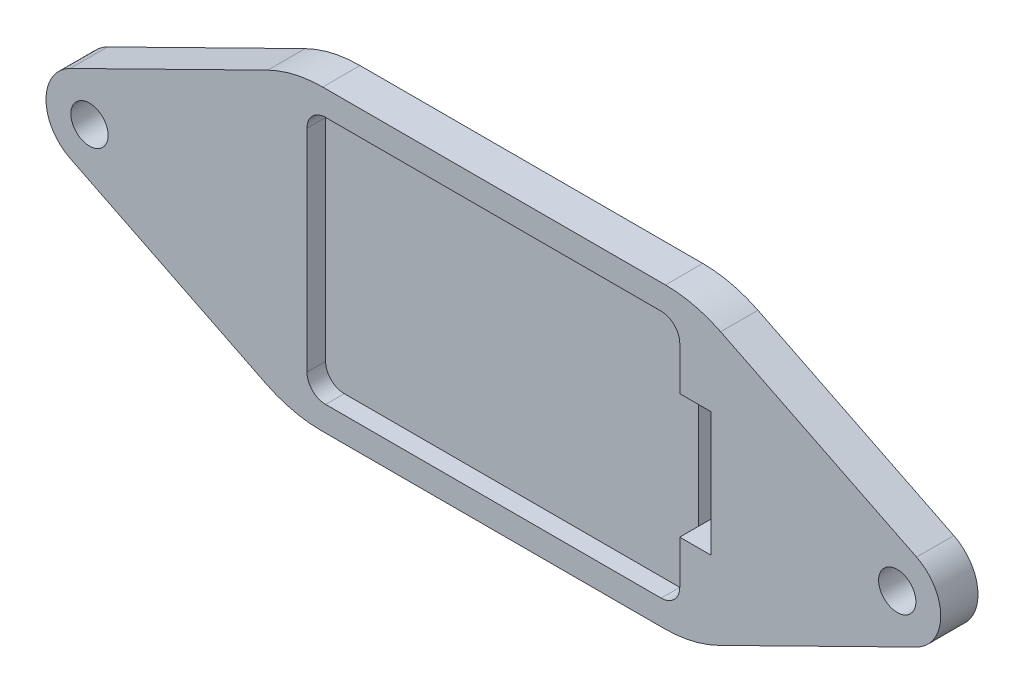
ISO-10303-21;
HEADER;
FILE_DESCRIPTION(('STEP AP214'),'2;1');
FILE_NAME('part.step','',(''),(''),'','','');
FILE_SCHEMA(('AUTOMOTIVE_DESIGN { 1 0 10303 214 1 1 1 1 }'));
ENDSEC;
DATA;
#1=APPLICATION_CONTEXT('core data for automotive mechanical design processes');
#2=APPLICATION_PROTOCOL_DEFINITION('international standard','automotive_design',2000,#1);
#3=PRODUCT_CONTEXT('',#1,'mechanical');
#4=PRODUCT('Part','Part','',(#3));
#5=PRODUCT_RELATED_PRODUCT_CATEGORY('part','',(#4));
#6=PRODUCT_DEFINITION_FORMATION('','',#4);
#7=PRODUCT_DEFINITION_CONTEXT('part definition',#1,'design');
#8=PRODUCT_DEFINITION('design','',#6,#7);
#9=PRODUCT_DEFINITION_SHAPE('','',#8);
#10=(LENGTH_UNIT() NAMED_UNIT(*) SI_UNIT(.MILLI.,.METRE.));
#11=(NAMED_UNIT(*) PLANE_ANGLE_UNIT() SI_UNIT($,.RADIAN.));
#12=(NAMED_UNIT(*) SI_UNIT($,.STERADIAN.) SOLID_ANGLE_UNIT());
#13=UNCERTAINTY_MEASURE_WITH_UNIT(LENGTH_MEASURE(1.E-05),#10,'distance_accuracy_value','');
#14=(GEOMETRIC_REPRESENTATION_CONTEXT(3) GLOBAL_UNCERTAINTY_ASSIGNED_CONTEXT((#13)) GLOBAL_UNIT_ASSIGNED_CONTEXT((#10,
#11,#12)) REPRESENTATION_CONTEXT('',''));
#15=CARTESIAN_POINT('',(0.,0.,0.));
#16=DIRECTION('',(0.,0.,1.));
#17=DIRECTION('',(1.,0.,0.));
#18=AXIS2_PLACEMENT_3D('',#15,#16,#17);
#19=CARTESIAN_POINT('',(0.,12.,3.));
#20=DIRECTION('',(0.,1.,0.));
#21=DIRECTION('',(-1.,0.,0.));
#22=AXIS2_PLACEMENT_3D('',#19,#20,#21);
#23=PLANE('',#22);
#24=DIRECTION('',(1.,0.,0.));
#25=VECTOR('',#24,1.);
#26=CARTESIAN_POINT('',(0.,12.,0.));
#27=LINE('',#26,#25);
#28=CARTESIAN_POINT('',(-13.7318893017713,12.,0.));
#29=VERTEX_POINT('',#28);
#30=CARTESIAN_POINT('',(13.8470717310372,12.,0.));
#31=VERTEX_POINT('',#30);
#32=EDGE_CURVE('E220',#29,#31,#27,.T.);
#33=ORIENTED_EDGE('',*,*,#32,.F.);
#34=DIRECTION('',(0.,0.,-1.));
#35=VECTOR('',#34,1.);
#36=CARTESIAN_POINT('',(-13.7318893017713,12.,3.));
#37=LINE('',#36,#35);
#38=CARTESIAN_POINT('',(-13.7318893017713,12.,3.));
#39=VERTEX_POINT('',#38);
#40=EDGE_CURVE('E11',#39,#29,#37,.T.);
#41=ORIENTED_EDGE('',*,*,#40,.F.);
#42=DIRECTION('',(1.,0.,0.));
#43=VECTOR('',#42,1.);
#44=CARTESIAN_POINT('',(0.,12.,3.));
#45=LINE('',#44,#43);
#46=CARTESIAN_POINT('',(13.8470717310372,12.,3.));
#47=VERTEX_POINT('',#46);
#48=EDGE_CURVE('E399',#39,#47,#45,.T.);
#49=ORIENTED_EDGE('',*,*,#48,.T.);
#50=DIRECTION('',(0.,0.,-1.));
#51=VECTOR('',#50,1.);
#52=CARTESIAN_POINT('',(13.8470717310372,12.,3.));
#53=LINE('',#52,#51);
#54=EDGE_CURVE('E105',#47,#31,#53,.T.);
#55=ORIENTED_EDGE('',*,*,#54,.T.);
#56=EDGE_LOOP('',(#33,#41,#49,#55));
#57=FACE_BOUND('',#56,.T.);
#58=ADVANCED_FACE('F33',(#57),#23,.T.);
#59=CARTESIAN_POINT('',(-13.7318893017713,2.,3.));
#60=DIRECTION('',(0.,0.,-1.));
#61=DIRECTION('',(-1.,0.,0.));
#62=AXIS2_PLACEMENT_3D('',#59,#60,#61);
#63=CYLINDRICAL_SURFACE('',#62,10.);
#64=CARTESIAN_POINT('',(-13.7318893017713,2.,0.));
#65=DIRECTION('',(0.,0.,1.));
#66=DIRECTION('',(1.,0.,0.));
#67=AXIS2_PLACEMENT_3D('',#64,#65,#66);
#68=CIRCLE('',#67,10.);
#69=CARTESIAN_POINT('',(-18.151142685381,10.9705183535543,0.));
#70=VERTEX_POINT('',#69);
#71=EDGE_CURVE('E223',#29,#70,#68,.T.);
#72=ORIENTED_EDGE('',*,*,#71,.T.);
#73=DIRECTION('',(0.,0.,-1.));
#74=VECTOR('',#73,1.);
#75=CARTESIAN_POINT('',(-18.151142685381,10.9705183535543,3.));
#76=LINE('',#75,#74);
#77=CARTESIAN_POINT('',(-18.151142685381,10.9705183535543,3.));
#78=VERTEX_POINT('',#77);
#79=EDGE_CURVE('E43',#78,#70,#76,.T.);
#80=ORIENTED_EDGE('',*,*,#79,.F.);
#81=CARTESIAN_POINT('',(-13.7318893017713,2.,3.));
#82=DIRECTION('',(0.,0.,1.));
#83=DIRECTION('',(1.,0.,0.));
#84=AXIS2_PLACEMENT_3D('',#81,#82,#83);
#85=CIRCLE('',#84,10.);
#86=EDGE_CURVE('E401',#39,#78,#85,.T.);
#87=ORIENTED_EDGE('',*,*,#86,.F.);
#88=ORIENTED_EDGE('',*,*,#40,.T.);
#89=EDGE_LOOP('',(#72,#80,#87,#88));
#90=FACE_BOUND('',#89,.T.);
#91=ADVANCED_FACE('F442',(#90),#63,.T.);
#92=CARTESIAN_POINT('',(-7.89392383654079,16.0236543394143,3.));
#93=DIRECTION('',(-0.44192533836097,0.897051835355428,0.));
#94=DIRECTION('',(-0.897051835355428,-0.441925338360971,0.));
#95=AXIS2_PLACEMENT_3D('',#92,#93,#94);
#96=PLANE('',#95);
#97=DIRECTION('',(0.897051835355428,0.441925338360971,0.));
#98=VECTOR('',#97,1.);
#99=CARTESIAN_POINT('',(-7.89392383654079,16.0236543394143,0.));
#100=LINE('',#99,#98);
#101=CARTESIAN_POINT('',(-34.0467386842634,3.139681423744,0.));
#102=VERTEX_POINT('',#101);
#103=EDGE_CURVE('E226',#102,#70,#100,.T.);
#104=ORIENTED_EDGE('',*,*,#103,.F.);
#105=DIRECTION('',(0.,0.,-1.));
#106=VECTOR('',#105,1.);
#107=CARTESIAN_POINT('',(-34.0467386842634,3.139681423744,3.));
#108=LINE('',#107,#106);
#109=CARTESIAN_POINT('',(-34.0467386842634,3.139681423744,3.));
#110=VERTEX_POINT('',#109);
#111=EDGE_CURVE('E267',#110,#102,#108,.T.);
#112=ORIENTED_EDGE('',*,*,#111,.F.);
#113=DIRECTION('',(0.897051835355428,0.441925338360971,0.));
#114=VECTOR('',#113,1.);
#115=CARTESIAN_POINT('',(-7.89392383654079,16.0236543394143,3.));
#116=LINE('',#115,#114);
#117=EDGE_CURVE('E403',#110,#78,#116,.T.);
#118=ORIENTED_EDGE('',*,*,#117,.T.);
#119=ORIENTED_EDGE('',*,*,#79,.T.);
#120=EDGE_LOOP('',(#104,#112,#118,#119));
#121=FACE_BOUND('',#120,.T.);
#122=ADVANCED_FACE('F447',(#121),#96,.T.);
#123=CARTESIAN_POINT('',(-32.5,0.,3.));
#124=DIRECTION('',(0.,0.,-1.));
#125=DIRECTION('',(-1.,0.,0.));
#126=AXIS2_PLACEMENT_3D('',#123,#124,#125);
#127=CYLINDRICAL_SURFACE('',#126,3.5);
#128=CARTESIAN_POINT('',(-32.5,0.,0.));
#129=DIRECTION('',(0.,0.,1.));
#130=DIRECTION('',(1.,0.,0.));
#131=AXIS2_PLACEMENT_3D('',#128,#129,#130);
#132=CIRCLE('',#131,3.5);
#133=CARTESIAN_POINT('',(-34.0558089860166,-3.13519670818755,0.));
#134=VERTEX_POINT('',#133);
#135=EDGE_CURVE('E229',#102,#134,#132,.T.);
#136=ORIENTED_EDGE('',*,*,#135,.T.);
#137=DIRECTION('',(0.,0.,-1.));
#138=VECTOR('',#137,1.);
#139=CARTESIAN_POINT('',(-34.0558089860166,-3.13519670818755,3.));
#140=LINE('',#139,#138);
#141=CARTESIAN_POINT('',(-34.0558089860166,-3.13519670818755,3.));
#142=VERTEX_POINT('',#141);
#143=EDGE_CURVE('E264',#142,#134,#140,.T.);
#144=ORIENTED_EDGE('',*,*,#143,.F.);
#145=CARTESIAN_POINT('',(-32.5,0.,3.));
#146=DIRECTION('',(0.,0.,1.));
#147=DIRECTION('',(1.,0.,0.));
#148=AXIS2_PLACEMENT_3D('',#145,#146,#147);
#149=CIRCLE('',#148,3.5);
#150=EDGE_CURVE('E406',#110,#142,#149,.T.);
#151=ORIENTED_EDGE('',*,*,#150,.F.);
#152=ORIENTED_EDGE('',*,*,#111,.T.);
#153=EDGE_LOOP('',(#136,#144,#151,#152));
#154=FACE_BOUND('',#153,.T.);
#155=ADVANCED_FACE('F565',(#154),#127,.T.);
#156=CARTESIAN_POINT('',(-7.97765404981442,-16.0762117591797,3.));
#157=DIRECTION('',(0.444516853147595,0.895770488053586,0.));
#158=DIRECTION('',(-0.895770488053586,0.444516853147596,0.));
#159=AXIS2_PLACEMENT_3D('',#156,#157,#158);
#160=PLANE('',#159);
#161=DIRECTION('',(0.895770488053586,-0.444516853147596,0.));
#162=VECTOR('',#161,1.);
#163=CARTESIAN_POINT('',(-7.97765404981442,-16.0762117591797,0.));
#164=LINE('',#163,#162);
#165=CARTESIAN_POINT('',(-18.2922402625132,-10.9577048805359,0.));
#166=VERTEX_POINT('',#165);
#167=EDGE_CURVE('E232',#134,#166,#164,.T.);
#168=ORIENTED_EDGE('',*,*,#167,.T.);
#169=DIRECTION('',(0.,0.,-1.));
#170=VECTOR('',#169,1.);
#171=CARTESIAN_POINT('',(-18.2922402625132,-10.9577048805359,3.));
#172=LINE('',#171,#170);
#173=CARTESIAN_POINT('',(-18.2922402625132,-10.9577048805359,3.));
#174=VERTEX_POINT('',#173);
#175=EDGE_CURVE('E262',#174,#166,#172,.T.);
#176=ORIENTED_EDGE('',*,*,#175,.F.);
#177=DIRECTION('',(0.895770488053586,-0.444516853147596,0.));
#178=VECTOR('',#177,1.);
#179=CARTESIAN_POINT('',(-7.97765404981442,-16.0762117591797,3.));
#180=LINE('',#179,#178);
#181=EDGE_CURVE('E409',#142,#174,#180,.T.);
#182=ORIENTED_EDGE('',*,*,#181,.F.);
#183=ORIENTED_EDGE('',*,*,#143,.T.);
#184=EDGE_LOOP('',(#168,#176,#182,#183));
#185=FACE_BOUND('',#184,.T.);
#186=ADVANCED_FACE('F567',(#185),#160,.F.);
#187=CARTESIAN_POINT('',(-13.8470717310372,-2.,3.));
#188=DIRECTION('',(0.,0.,-1.));
#189=DIRECTION('',(-1.,0.,0.));
#190=AXIS2_PLACEMENT_3D('',#187,#188,#189);
#191=CYLINDRICAL_SURFACE('',#190,10.);
#192=CARTESIAN_POINT('',(-13.8470717310372,-2.,0.));
#193=DIRECTION('',(0.,0.,1.));
#194=DIRECTION('',(1.,0.,0.));
#195=AXIS2_PLACEMENT_3D('',#192,#193,#194);
#196=CIRCLE('',#195,10.);
#197=CARTESIAN_POINT('',(-13.8470717310372,-12.,0.));
#198=VERTEX_POINT('',#197);
#199=EDGE_CURVE('E235',#198,#166,#196,.F.);
#200=ORIENTED_EDGE('',*,*,#199,.F.);
#201=DIRECTION('',(0.,0.,-1.));
#202=VECTOR('',#201,1.);
#203=CARTESIAN_POINT('',(-13.8470717310372,-12.,3.));
#204=LINE('',#203,#202);
#205=CARTESIAN_POINT('',(-13.8470717310372,-12.,3.));
#206=VERTEX_POINT('',#205);
#207=EDGE_CURVE('E260',#206,#198,#204,.T.);
#208=ORIENTED_EDGE('',*,*,#207,.F.);
#209=CARTESIAN_POINT('',(-13.8470717310372,-2.,3.));
#210=DIRECTION('',(0.,0.,1.));
#211=DIRECTION('',(1.,0.,0.));
#212=AXIS2_PLACEMENT_3D('',#209,#210,#211);
#213=CIRCLE('',#212,10.);
#214=EDGE_CURVE('E411',#206,#174,#213,.F.);
#215=ORIENTED_EDGE('',*,*,#214,.T.);
#216=ORIENTED_EDGE('',*,*,#175,.T.);
#217=EDGE_LOOP('',(#200,#208,#215,#216));
#218=FACE_BOUND('',#217,.T.);
#219=ADVANCED_FACE('F570',(#218),#191,.T.);
#220=CARTESIAN_POINT('',(0.,-12.,3.));
#221=DIRECTION('',(0.,1.,0.));
#222=DIRECTION('',(-1.,0.,0.));
#223=AXIS2_PLACEMENT_3D('',#220,#221,#222);
#224=PLANE('',#223);
#225=DIRECTION('',(1.,0.,0.));
#226=VECTOR('',#225,1.);
#227=CARTESIAN_POINT('',(0.,-12.,0.));
#228=LINE('',#227,#226);
#229=CARTESIAN_POINT('',(13.7318893017713,-12.,0.));
#230=VERTEX_POINT('',#229);
#231=EDGE_CURVE('E238',#198,#230,#228,.T.);
#232=ORIENTED_EDGE('',*,*,#231,.T.);
#233=DIRECTION('',(0.,0.,-1.));
#234=VECTOR('',#233,1.);
#235=CARTESIAN_POINT('',(13.7318893017713,-12.,3.));
#236=LINE('',#235,#234);
#237=CARTESIAN_POINT('',(13.7318893017713,-12.,3.));
#238=VERTEX_POINT('',#237);
#239=EDGE_CURVE('E258',#238,#230,#236,.T.);
#240=ORIENTED_EDGE('',*,*,#239,.F.);
#241=DIRECTION('',(1.,0.,0.));
#242=VECTOR('',#241,1.);
#243=CARTESIAN_POINT('',(0.,-12.,3.));
#244=LINE('',#243,#242);
#245=EDGE_CURVE('E414',#206,#238,#244,.T.);
#246=ORIENTED_EDGE('',*,*,#245,.F.);
#247=ORIENTED_EDGE('',*,*,#207,.T.);
#248=EDGE_LOOP('',(#232,#240,#246,#247));
#249=FACE_BOUND('',#248,.T.);
#250=ADVANCED_FACE('F425',(#249),#224,.F.);
#251=CARTESIAN_POINT('',(13.7318893017713,-2.,3.));
#252=DIRECTION('',(0.,0.,-1.));
#253=DIRECTION('',(-1.,0.,0.));
#254=AXIS2_PLACEMENT_3D('',#251,#252,#253);
#255=CYLINDRICAL_SURFACE('',#254,10.);
#256=CARTESIAN_POINT('',(13.7318893017713,-2.,0.));
#257=DIRECTION('',(0.,0.,1.));
#258=DIRECTION('',(1.,0.,0.));
#259=AXIS2_PLACEMENT_3D('',#256,#257,#258);
#260=CIRCLE('',#259,10.);
#261=CARTESIAN_POINT('',(18.151142685381,-10.9705183535543,0.));
#262=VERTEX_POINT('',#261);
#263=EDGE_CURVE('E241',#262,#230,#260,.F.);
#264=ORIENTED_EDGE('',*,*,#263,.F.);
#265=DIRECTION('',(0.,0.,-1.));
#266=VECTOR('',#265,1.);
#267=CARTESIAN_POINT('',(18.151142685381,-10.9705183535543,3.));
#268=LINE('',#267,#266);
#269=CARTESIAN_POINT('',(18.151142685381,-10.9705183535543,3.));
#270=VERTEX_POINT('',#269);
#271=EDGE_CURVE('E256',#270,#262,#268,.T.);
#272=ORIENTED_EDGE('',*,*,#271,.F.);
#273=CARTESIAN_POINT('',(13.7318893017713,-2.,3.));
#274=DIRECTION('',(0.,0.,1.));
#275=DIRECTION('',(1.,0.,0.));
#276=AXIS2_PLACEMENT_3D('',#273,#274,#275);
#277=CIRCLE('',#276,10.);
#278=EDGE_CURVE('E416',#270,#238,#277,.F.);
#279=ORIENTED_EDGE('',*,*,#278,.T.);
#280=ORIENTED_EDGE('',*,*,#239,.T.);
#281=EDGE_LOOP('',(#264,#272,#279,#280));
#282=FACE_BOUND('',#281,.T.);
#283=ADVANCED_FACE('F420',(#282),#255,.T.);
#284=CARTESIAN_POINT('',(7.89392383654079,-16.0236543394143,3.));
#285=DIRECTION('',(-0.44192533836097,0.897051835355428,0.));
#286=DIRECTION('',(-0.897051835355428,-0.44192533836097,0.));
#287=AXIS2_PLACEMENT_3D('',#284,#285,#286);
#288=PLANE('',#287);
#289=DIRECTION('',(0.897051835355428,0.44192533836097,0.));
#290=VECTOR('',#289,1.);
#291=CARTESIAN_POINT('',(7.89392383654079,-16.0236543394143,0.));
#292=LINE('',#291,#290);
#293=CARTESIAN_POINT('',(34.0467386842634,-3.13968142374399,0.));
#294=VERTEX_POINT('',#293);
#295=EDGE_CURVE('E244',#262,#294,#292,.T.);
#296=ORIENTED_EDGE('',*,*,#295,.T.);
#297=DIRECTION('',(0.,0.,-1.));
#298=VECTOR('',#297,1.);
#299=CARTESIAN_POINT('',(34.0467386842634,-3.13968142374399,3.));
#300=LINE('',#299,#298);
#301=CARTESIAN_POINT('',(34.0467386842634,-3.13968142374399,3.));
#302=VERTEX_POINT('',#301);
#303=EDGE_CURVE('E196',#302,#294,#300,.T.);
#304=ORIENTED_EDGE('',*,*,#303,.F.);
#305=DIRECTION('',(0.897051835355428,0.44192533836097,0.));
#306=VECTOR('',#305,1.);
#307=CARTESIAN_POINT('',(7.89392383654079,-16.0236543394143,3.));
#308=LINE('',#307,#306);
#309=EDGE_CURVE('E184',#270,#302,#308,.T.);
#310=ORIENTED_EDGE('',*,*,#309,.F.);
#311=ORIENTED_EDGE('',*,*,#271,.T.);
#312=EDGE_LOOP('',(#296,#304,#310,#311));
#313=FACE_BOUND('',#312,.T.);
#314=ADVANCED_FACE('F432',(#313),#288,.F.);
#315=CARTESIAN_POINT('',(32.5,0.,3.));
#316=DIRECTION('',(0.,0.,-1.));
#317=DIRECTION('',(-1.,0.,0.));
#318=AXIS2_PLACEMENT_3D('',#315,#316,#317);
#319=CYLINDRICAL_SURFACE('',#318,3.5);
#320=CARTESIAN_POINT('',(32.5,0.,0.));
#321=DIRECTION('',(0.,0.,1.));
#322=DIRECTION('',(1.,0.,0.));
#323=AXIS2_PLACEMENT_3D('',#320,#321,#322);
#324=CIRCLE('',#323,3.5);
#325=CARTESIAN_POINT('',(34.0558089860166,3.13519670818756,0.));
#326=VERTEX_POINT('',#325);
#327=EDGE_CURVE('E192',#294,#326,#324,.T.);
#328=ORIENTED_EDGE('',*,*,#327,.T.);
#329=DIRECTION('',(0.,0.,-1.));
#330=VECTOR('',#329,1.);
#331=CARTESIAN_POINT('',(34.0558089860166,3.13519670818756,3.));
#332=LINE('',#331,#330);
#333=CARTESIAN_POINT('',(34.0558089860166,3.13519670818756,3.));
#334=VERTEX_POINT('',#333);
#335=EDGE_CURVE('E190',#334,#326,#332,.T.);
#336=ORIENTED_EDGE('',*,*,#335,.F.);
#337=CARTESIAN_POINT('',(32.5,0.,3.));
#338=DIRECTION('',(0.,0.,1.));
#339=DIRECTION('',(1.,0.,0.));
#340=AXIS2_PLACEMENT_3D('',#337,#338,#339);
#341=CIRCLE('',#340,3.5);
#342=EDGE_CURVE('E177',#302,#334,#341,.T.);
#343=ORIENTED_EDGE('',*,*,#342,.F.);
#344=ORIENTED_EDGE('',*,*,#303,.T.);
#345=EDGE_LOOP('',(#328,#336,#343,#344));
#346=FACE_BOUND('',#345,.T.);
#347=ADVANCED_FACE('F191',(#346),#319,.T.);
#348=CARTESIAN_POINT('',(7.97765404981441,16.0762117591797,3.));
#349=DIRECTION('',(0.444516853147595,0.895770488053586,0.));
#350=DIRECTION('',(-0.895770488053586,0.444516853147595,0.));
#351=AXIS2_PLACEMENT_3D('',#348,#349,#350);
#352=PLANE('',#351);
#353=DIRECTION('',(0.895770488053586,-0.444516853147595,0.));
#354=VECTOR('',#353,1.);
#355=CARTESIAN_POINT('',(7.97765404981441,16.0762117591797,0.));
#356=LINE('',#355,#354);
#357=CARTESIAN_POINT('',(18.2922402625132,10.9577048805359,0.));
#358=VERTEX_POINT('',#357);
#359=EDGE_CURVE('E248',#358,#326,#356,.T.);
#360=ORIENTED_EDGE('',*,*,#359,.F.);
#361=DIRECTION('',(0.,0.,-1.));
#362=VECTOR('',#361,1.);
#363=CARTESIAN_POINT('',(18.2922402625132,10.9577048805359,3.));
#364=LINE('',#363,#362);
#365=CARTESIAN_POINT('',(18.2922402625132,10.9577048805359,3.));
#366=VERTEX_POINT('',#365);
#367=EDGE_CURVE('E98',#366,#358,#364,.T.);
#368=ORIENTED_EDGE('',*,*,#367,.F.);
#369=DIRECTION('',(0.895770488053586,-0.444516853147595,0.));
#370=VECTOR('',#369,1.);
#371=CARTESIAN_POINT('',(7.97765404981441,16.0762117591797,3.));
#372=LINE('',#371,#370);
#373=EDGE_CURVE('E181',#366,#334,#372,.T.);
#374=ORIENTED_EDGE('',*,*,#373,.T.);
#375=ORIENTED_EDGE('',*,*,#335,.T.);
#376=EDGE_LOOP('',(#360,#368,#374,#375));
#377=FACE_BOUND('',#376,.T.);
#378=ADVANCED_FACE('F198',(#377),#352,.T.);
#379=CARTESIAN_POINT('',(-13.5,8.5,3.));
#380=DIRECTION('',(0.,0.,-1.));
#381=DIRECTION('',(-1.,0.,0.));
#382=AXIS2_PLACEMENT_3D('',#379,#380,#381);
#383=CYLINDRICAL_SURFACE('',#382,1.5);
#384=CARTESIAN_POINT('',(-13.5,8.5,1.5));
#385=DIRECTION('',(0.,0.,1.));
#386=DIRECTION('',(1.,0.,0.));
#387=AXIS2_PLACEMENT_3D('',#384,#385,#386);
#388=CIRCLE('',#387,1.5);
#389=CARTESIAN_POINT('',(-13.5,10.,1.5));
#390=VERTEX_POINT('',#389);
#391=CARTESIAN_POINT('',(-15.,8.49999999999999,1.5));
#392=VERTEX_POINT('',#391);
#393=EDGE_CURVE('E501',#390,#392,#388,.T.);
#394=ORIENTED_EDGE('',*,*,#393,.F.);
#395=DIRECTION('',(0.,0.,-1.));
#396=VECTOR('',#395,1.);
#397=CARTESIAN_POINT('',(-13.5,10.,3.));
#398=LINE('',#397,#396);
#399=CARTESIAN_POINT('',(-13.5,10.,3.));
#400=VERTEX_POINT('',#399);
#401=EDGE_CURVE('E37',#400,#390,#398,.T.);
#402=ORIENTED_EDGE('',*,*,#401,.F.);
#403=CARTESIAN_POINT('',(-13.5,8.5,3.));
#404=DIRECTION('',(0.,0.,1.));
#405=DIRECTION('',(1.,0.,0.));
#406=AXIS2_PLACEMENT_3D('',#403,#404,#405);
#407=CIRCLE('',#406,1.5);
#408=CARTESIAN_POINT('',(-15.,8.49999999999999,3.));
#409=VERTEX_POINT('',#408);
#410=EDGE_CURVE('E252',#400,#409,#407,.T.);
#411=ORIENTED_EDGE('',*,*,#410,.T.);
#412=DIRECTION('',(0.,0.,-1.));
#413=VECTOR('',#412,1.);
#414=CARTESIAN_POINT('',(-15.,8.49999999999999,3.));
#415=LINE('',#414,#413);
#416=EDGE_CURVE('E200',#409,#392,#415,.T.);
#417=ORIENTED_EDGE('',*,*,#416,.T.);
#418=EDGE_LOOP('',(#394,#402,#411,#417));
#419=FACE_BOUND('',#418,.T.);
#420=ADVANCED_FACE('F35',(#419),#383,.F.);
#421=CARTESIAN_POINT('',(0.,10.,3.));
#422=DIRECTION('',(0.,1.,0.));
#423=DIRECTION('',(0.,0.,1.));
#424=AXIS2_PLACEMENT_3D('',#421,#422,#423);
#425=PLANE('',#424);
#426=ORIENTED_EDGE('',*,*,#401,.T.);
#427=DIRECTION('',(1.,0.,0.));
#428=VECTOR('',#427,1.);
#429=CARTESIAN_POINT('',(0.,10.,1.5));
#430=LINE('',#429,#428);
#431=CARTESIAN_POINT('',(13.5,10.,1.5));
#432=VERTEX_POINT('',#431);
#433=EDGE_CURVE('E308',#390,#432,#430,.T.);
#434=ORIENTED_EDGE('',*,*,#433,.T.);
#435=DIRECTION('',(0.,0.,-1.));
#436=VECTOR('',#435,1.);
#437=CARTESIAN_POINT('',(13.5,10.,3.));
#438=LINE('',#437,#436);
#439=CARTESIAN_POINT('',(13.5,10.,3.));
#440=VERTEX_POINT('',#439);
#441=EDGE_CURVE('E296',#440,#432,#438,.T.);
#442=ORIENTED_EDGE('',*,*,#441,.F.);
#443=DIRECTION('',(1.,0.,0.));
#444=VECTOR('',#443,1.);
#445=CARTESIAN_POINT('',(0.,10.,3.));
#446=LINE('',#445,#444);
#447=EDGE_CURVE('E309',#400,#440,#446,.T.);
#448=ORIENTED_EDGE('',*,*,#447,.F.);
#449=EDGE_LOOP('',(#426,#434,#442,#448));
#450=FACE_BOUND('',#449,.T.);
#451=ADVANCED_FACE('F306',(#450),#425,.F.);
#452=CARTESIAN_POINT('',(13.5,8.5,3.));
#453=DIRECTION('',(0.,0.,-1.));
#454=DIRECTION('',(-1.,0.,0.));
#455=AXIS2_PLACEMENT_3D('',#452,#453,#454);
#456=CYLINDRICAL_SURFACE('',#455,1.5);
#457=CARTESIAN_POINT('',(13.5,8.5,1.5));
#458=DIRECTION('',(0.,0.,1.));
#459=DIRECTION('',(1.,0.,0.));
#460=AXIS2_PLACEMENT_3D('',#457,#458,#459);
#461=CIRCLE('',#460,1.5);
#462=CARTESIAN_POINT('',(15.,8.49999999999999,1.5));
#463=VERTEX_POINT('',#462);
#464=EDGE_CURVE('E516',#463,#432,#461,.T.);
#465=ORIENTED_EDGE('',*,*,#464,.F.);
#466=DIRECTION('',(0.,0.,-1.));
#467=VECTOR('',#466,1.);
#468=CARTESIAN_POINT('',(15.,8.49999999999999,3.));
#469=LINE('',#468,#467);
#470=CARTESIAN_POINT('',(15.,8.49999999999999,3.));
#471=VERTEX_POINT('',#470);
#472=EDGE_CURVE('E294',#471,#463,#469,.T.);
#473=ORIENTED_EDGE('',*,*,#472,.F.);
#474=CARTESIAN_POINT('',(13.5,8.5,3.));
#475=DIRECTION('',(0.,0.,1.));
#476=DIRECTION('',(1.,0.,0.));
#477=AXIS2_PLACEMENT_3D('',#474,#475,#476);
#478=CIRCLE('',#477,1.5);
#479=EDGE_CURVE('E378',#471,#440,#478,.T.);
#480=ORIENTED_EDGE('',*,*,#479,.T.);
#481=ORIENTED_EDGE('',*,*,#441,.T.);
#482=EDGE_LOOP('',(#465,#473,#480,#481));
#483=FACE_BOUND('',#482,.T.);
#484=ADVANCED_FACE('F491',(#483),#456,.F.);
#485=CARTESIAN_POINT('',(15.,0.,3.));
#486=DIRECTION('',(-1.,0.,0.));
#487=DIRECTION('',(0.,0.,1.));
#488=AXIS2_PLACEMENT_3D('',#485,#486,#487);
#489=PLANE('',#488);
#490=DIRECTION('',(0.,1.,0.));
#491=VECTOR('',#490,1.);
#492=CARTESIAN_POINT('',(15.,0.,1.5));
#493=LINE('',#492,#491);
#494=CARTESIAN_POINT('',(15.,4.99999999999999,1.5));
#495=VERTEX_POINT('',#494);
#496=EDGE_CURVE('E356',#495,#463,#493,.T.);
#497=ORIENTED_EDGE('',*,*,#496,.F.);
#498=DIRECTION('',(0.,0.,-1.));
#499=VECTOR('',#498,1.);
#500=CARTESIAN_POINT('',(15.,4.99999999999999,3.));
#501=LINE('',#500,#499);
#502=CARTESIAN_POINT('',(15.,4.99999999999999,3.));
#503=VERTEX_POINT('',#502);
#504=EDGE_CURVE('E291',#503,#495,#501,.T.);
#505=ORIENTED_EDGE('',*,*,#504,.F.);
#506=DIRECTION('',(0.,1.,0.));
#507=VECTOR('',#506,1.);
#508=CARTESIAN_POINT('',(15.,0.,3.));
#509=LINE('',#508,#507);
#510=EDGE_CURVE('E374',#503,#471,#509,.T.);
#511=ORIENTED_EDGE('',*,*,#510,.T.);
#512=ORIENTED_EDGE('',*,*,#472,.T.);
#513=EDGE_LOOP('',(#497,#505,#511,#512));
#514=FACE_BOUND('',#513,.T.);
#515=ADVANCED_FACE('F362',(#514),#489,.T.);
#516=CARTESIAN_POINT('',(0.,4.99999999999999,3.));
#517=DIRECTION('',(0.,-1.,0.));
#518=DIRECTION('',(0.,0.,-1.));
#519=AXIS2_PLACEMENT_3D('',#516,#517,#518);
#520=PLANE('',#519);
#521=DIRECTION('',(-1.,0.,0.));
#522=VECTOR('',#521,1.);
#523=CARTESIAN_POINT('',(0.,4.99999999999999,0.));
#524=LINE('',#523,#522);
#525=CARTESIAN_POINT('',(17.5,4.99999999999999,0.));
#526=VERTEX_POINT('',#525);
#527=CARTESIAN_POINT('',(15.,4.99999999999999,0.));
#528=VERTEX_POINT('',#527);
#529=EDGE_CURVE('E204',#526,#528,#524,.T.);
#530=ORIENTED_EDGE('',*,*,#529,.F.);
#531=DIRECTION('',(0.,0.,-1.));
#532=VECTOR('',#531,1.);
#533=CARTESIAN_POINT('',(17.5,4.99999999999999,3.));
#534=LINE('',#533,#532);
#535=CARTESIAN_POINT('',(17.5,4.99999999999999,3.));
#536=VERTEX_POINT('',#535);
#537=EDGE_CURVE('E289',#536,#526,#534,.T.);
#538=ORIENTED_EDGE('',*,*,#537,.F.);
#539=DIRECTION('',(-1.,0.,0.));
#540=VECTOR('',#539,1.);
#541=CARTESIAN_POINT('',(0.,4.99999999999999,3.));
#542=LINE('',#541,#540);
#543=EDGE_CURVE('E369',#536,#503,#542,.T.);
#544=ORIENTED_EDGE('',*,*,#543,.T.);
#545=ORIENTED_EDGE('',*,*,#504,.T.);
#546=DIRECTION('',(0.,0.,-1.));
#547=VECTOR('',#546,1.);
#548=CARTESIAN_POINT('',(15.,4.99999999999999,3.));
#549=LINE('',#548,#547);
#550=EDGE_CURVE('E208',#495,#528,#549,.T.);
#551=ORIENTED_EDGE('',*,*,#550,.T.);
#552=EDGE_LOOP('',(#530,#538,#544,#545,#551));
#553=FACE_BOUND('',#552,.T.);
#554=ADVANCED_FACE('F367',(#553),#520,.T.);
#555=CARTESIAN_POINT('',(17.5,0.,3.));
#556=DIRECTION('',(-1.,0.,0.));
#557=DIRECTION('',(0.,0.,1.));
#558=AXIS2_PLACEMENT_3D('',#555,#556,#557);
#559=PLANE('',#558);
#560=DIRECTION('',(0.,1.,0.));
#561=VECTOR('',#560,1.);
#562=CARTESIAN_POINT('',(17.5,0.,0.));
#563=LINE('',#562,#561);
#564=CARTESIAN_POINT('',(17.5,-5.00000000000001,0.));
#565=VERTEX_POINT('',#564);
#566=EDGE_CURVE('E207',#565,#526,#563,.T.);
#567=ORIENTED_EDGE('',*,*,#566,.F.);
#568=DIRECTION('',(0.,0.,-1.));
#569=VECTOR('',#568,1.);
#570=CARTESIAN_POINT('',(17.5,-5.00000000000001,3.));
#571=LINE('',#570,#569);
#572=CARTESIAN_POINT('',(17.5,-5.00000000000001,3.));
#573=VERTEX_POINT('',#572);
#574=EDGE_CURVE('E287',#573,#565,#571,.T.);
#575=ORIENTED_EDGE('',*,*,#574,.F.);
#576=DIRECTION('',(0.,1.,0.));
#577=VECTOR('',#576,1.);
#578=CARTESIAN_POINT('',(17.5,0.,3.));
#579=LINE('',#578,#577);
#580=EDGE_CURVE('E373',#573,#536,#579,.T.);
#581=ORIENTED_EDGE('',*,*,#580,.T.);
#582=ORIENTED_EDGE('',*,*,#537,.T.);
#583=EDGE_LOOP('',(#567,#575,#581,#582));
#584=FACE_BOUND('',#583,.T.);
#585=ADVANCED_FACE('F484',(#584),#559,.T.);
#586=CARTESIAN_POINT('',(0.,-5.00000000000002,3.));
#587=DIRECTION('',(0.,-1.,0.));
#588=DIRECTION('',(1.,0.,0.));
#589=AXIS2_PLACEMENT_3D('',#586,#587,#588);
#590=PLANE('',#589);
#591=DIRECTION('',(-1.,0.,0.));
#592=VECTOR('',#591,1.);
#593=CARTESIAN_POINT('',(0.,-5.00000000000002,0.));
#594=LINE('',#593,#592);
#595=CARTESIAN_POINT('',(15.,-5.00000000000001,0.));
#596=VERTEX_POINT('',#595);
#597=EDGE_CURVE('E211',#565,#596,#594,.T.);
#598=ORIENTED_EDGE('',*,*,#597,.T.);
#599=DIRECTION('',(0.,0.,-1.));
#600=VECTOR('',#599,1.);
#601=CARTESIAN_POINT('',(15.,-5.00000000000001,3.));
#602=LINE('',#601,#600);
#603=CARTESIAN_POINT('',(15.,-5.00000000000001,1.5));
#604=VERTEX_POINT('',#603);
#605=EDGE_CURVE('E352',#604,#596,#602,.T.);
#606=ORIENTED_EDGE('',*,*,#605,.F.);
#607=DIRECTION('',(0.,0.,-1.));
#608=VECTOR('',#607,1.);
#609=CARTESIAN_POINT('',(15.,-5.00000000000001,3.));
#610=LINE('',#609,#608);
#611=CARTESIAN_POINT('',(15.,-5.00000000000001,3.));
#612=VERTEX_POINT('',#611);
#613=EDGE_CURVE('E284',#612,#604,#610,.T.);
#614=ORIENTED_EDGE('',*,*,#613,.F.);
#615=DIRECTION('',(-1.,0.,0.));
#616=VECTOR('',#615,1.);
#617=CARTESIAN_POINT('',(0.,-5.00000000000002,3.));
#618=LINE('',#617,#616);
#619=EDGE_CURVE('E376',#573,#612,#618,.T.);
#620=ORIENTED_EDGE('',*,*,#619,.F.);
#621=ORIENTED_EDGE('',*,*,#574,.T.);
#622=EDGE_LOOP('',(#598,#606,#614,#620,#621));
#623=FACE_BOUND('',#622,.T.);
#624=ADVANCED_FACE('F480',(#623),#590,.F.);
#625=CARTESIAN_POINT('',(15.,-8.49999999999999,1.5));
#626=VERTEX_POINT('',#625);
#627=EDGE_CURVE('E358',#626,#604,#493,.T.);
#628=ORIENTED_EDGE('',*,*,#627,.F.);
#629=DIRECTION('',(0.,0.,-1.));
#630=VECTOR('',#629,1.);
#631=CARTESIAN_POINT('',(15.,-8.49999999999999,3.));
#632=LINE('',#631,#630);
#633=CARTESIAN_POINT('',(15.,-8.49999999999999,3.));
#634=VERTEX_POINT('',#633);
#635=EDGE_CURVE('E281',#634,#626,#632,.T.);
#636=ORIENTED_EDGE('',*,*,#635,.F.);
#637=EDGE_CURVE('E380',#634,#612,#509,.T.);
#638=ORIENTED_EDGE('',*,*,#637,.T.);
#639=ORIENTED_EDGE('',*,*,#613,.T.);
#640=EDGE_LOOP('',(#628,#636,#638,#639));
#641=FACE_BOUND('',#640,.T.);
#642=ADVANCED_FACE('F476',(#641),#489,.T.);
#643=CARTESIAN_POINT('',(13.5,-8.5,3.));
#644=DIRECTION('',(0.,0.,-1.));
#645=DIRECTION('',(-1.,0.,0.));
#646=AXIS2_PLACEMENT_3D('',#643,#644,#645);
#647=CYLINDRICAL_SURFACE('',#646,1.5);
#648=ORIENTED_EDGE('',*,*,#635,.T.);
#649=CARTESIAN_POINT('',(13.5,-8.5,1.5));
#650=DIRECTION('',(0.,0.,1.));
#651=DIRECTION('',(1.,0.,0.));
#652=AXIS2_PLACEMENT_3D('',#649,#650,#651);
#653=CIRCLE('',#652,1.5);
#654=CARTESIAN_POINT('',(13.5,-10.,1.5));
#655=VERTEX_POINT('',#654);
#656=EDGE_CURVE('E365',#626,#655,#653,.F.);
#657=ORIENTED_EDGE('',*,*,#656,.T.);
#658=DIRECTION('',(0.,0.,-1.));
#659=VECTOR('',#658,1.);
#660=CARTESIAN_POINT('',(13.5,-10.,3.));
#661=LINE('',#660,#659);
#662=CARTESIAN_POINT('',(13.5,-10.,3.));
#663=VERTEX_POINT('',#662);
#664=EDGE_CURVE('E278',#663,#655,#661,.T.);
#665=ORIENTED_EDGE('',*,*,#664,.F.);
#666=CARTESIAN_POINT('',(13.5,-8.5,3.));
#667=DIRECTION('',(0.,0.,1.));
#668=DIRECTION('',(1.,0.,0.));
#669=AXIS2_PLACEMENT_3D('',#666,#667,#668);
#670=CIRCLE('',#669,1.5);
#671=EDGE_CURVE('E384',#634,#663,#670,.F.);
#672=ORIENTED_EDGE('',*,*,#671,.F.);
#673=EDGE_LOOP('',(#648,#657,#665,#672));
#674=FACE_BOUND('',#673,.T.);
#675=ADVANCED_FACE('F472',(#674),#647,.F.);
#676=CARTESIAN_POINT('',(0.,-10.,3.));
#677=DIRECTION('',(0.,1.,0.));
#678=DIRECTION('',(0.,0.,1.));
#679=AXIS2_PLACEMENT_3D('',#676,#677,#678);
#680=PLANE('',#679);
#681=DIRECTION('',(1.,0.,0.));
#682=VECTOR('',#681,1.);
#683=CARTESIAN_POINT('',(0.,-10.,1.5));
#684=LINE('',#683,#682);
#685=CARTESIAN_POINT('',(-13.5,-10.,1.5));
#686=VERTEX_POINT('',#685);
#687=EDGE_CURVE('E512',#686,#655,#684,.T.);
#688=ORIENTED_EDGE('',*,*,#687,.F.);
#689=DIRECTION('',(0.,0.,-1.));
#690=VECTOR('',#689,1.);
#691=CARTESIAN_POINT('',(-13.5,-10.,3.));
#692=LINE('',#691,#690);
#693=CARTESIAN_POINT('',(-13.5,-10.,3.));
#694=VERTEX_POINT('',#693);
#695=EDGE_CURVE('E275',#694,#686,#692,.T.);
#696=ORIENTED_EDGE('',*,*,#695,.F.);
#697=DIRECTION('',(1.,0.,0.));
#698=VECTOR('',#697,1.);
#699=CARTESIAN_POINT('',(0.,-10.,3.));
#700=LINE('',#699,#698);
#701=EDGE_CURVE('E386',#694,#663,#700,.T.);
#702=ORIENTED_EDGE('',*,*,#701,.T.);
#703=ORIENTED_EDGE('',*,*,#664,.T.);
#704=EDGE_LOOP('',(#688,#696,#702,#703));
#705=FACE_BOUND('',#704,.T.);
#706=ADVANCED_FACE('F468',(#705),#680,.T.);
#707=CARTESIAN_POINT('',(-13.5,-8.5,3.));
#708=DIRECTION('',(0.,0.,-1.));
#709=DIRECTION('',(-1.,0.,0.));
#710=AXIS2_PLACEMENT_3D('',#707,#708,#709);
#711=CYLINDRICAL_SURFACE('',#710,1.5);
#712=ORIENTED_EDGE('',*,*,#695,.T.);
#713=CARTESIAN_POINT('',(-13.5,-8.5,1.5));
#714=DIRECTION('',(0.,0.,1.));
#715=DIRECTION('',(1.,0.,0.));
#716=AXIS2_PLACEMENT_3D('',#713,#714,#715);
#717=CIRCLE('',#716,1.5);
#718=CARTESIAN_POINT('',(-15.,-8.49999999999999,1.5));
#719=VERTEX_POINT('',#718);
#720=EDGE_CURVE('E506',#686,#719,#717,.F.);
#721=ORIENTED_EDGE('',*,*,#720,.T.);
#722=DIRECTION('',(0.,0.,-1.));
#723=VECTOR('',#722,1.);
#724=CARTESIAN_POINT('',(-15.,-8.49999999999999,3.));
#725=LINE('',#724,#723);
#726=CARTESIAN_POINT('',(-15.,-8.49999999999999,3.));
#727=VERTEX_POINT('',#726);
#728=EDGE_CURVE('E272',#727,#719,#725,.T.);
#729=ORIENTED_EDGE('',*,*,#728,.F.);
#730=CARTESIAN_POINT('',(-13.5,-8.5,3.));
#731=DIRECTION('',(0.,0.,1.));
#732=DIRECTION('',(1.,0.,0.));
#733=AXIS2_PLACEMENT_3D('',#730,#731,#732);
#734=CIRCLE('',#733,1.5);
#735=EDGE_CURVE('E389',#694,#727,#734,.F.);
#736=ORIENTED_EDGE('',*,*,#735,.F.);
#737=EDGE_LOOP('',(#712,#721,#729,#736));
#738=FACE_BOUND('',#737,.T.);
#739=ADVANCED_FACE('F456',(#738),#711,.F.);
#740=CARTESIAN_POINT('',(32.5,0.,3.));
#741=DIRECTION('',(0.,0.,-1.));
#742=DIRECTION('',(-1.,0.,0.));
#743=AXIS2_PLACEMENT_3D('',#740,#741,#742);
#744=CYLINDRICAL_SURFACE('',#743,1.5);
#745=CARTESIAN_POINT('',(32.5,0.,3.));
#746=DIRECTION('',(0.,0.,1.));
#747=DIRECTION('',(1.,0.,0.));
#748=AXIS2_PLACEMENT_3D('',#745,#746,#747);
#749=CIRCLE('',#748,1.5);
#750=CARTESIAN_POINT('',(34.,0.,3.));
#751=VERTEX_POINT('',#750);
#752=EDGE_CURVE('E396',#751,#751,#749,.T.);
#753=ORIENTED_EDGE('',*,*,#752,.T.);
#754=EDGE_LOOP('',(#753));
#755=FACE_BOUND('',#754,.T.);
#756=CARTESIAN_POINT('',(32.5,0.,0.));
#757=DIRECTION('',(0.,0.,1.));
#758=DIRECTION('',(1.,0.,0.));
#759=AXIS2_PLACEMENT_3D('',#756,#757,#758);
#760=CIRCLE('',#759,1.5);
#761=CARTESIAN_POINT('',(34.,0.,0.));
#762=VERTEX_POINT('',#761);
#763=EDGE_CURVE('E217',#762,#762,#760,.T.);
#764=ORIENTED_EDGE('',*,*,#763,.F.);
#765=EDGE_LOOP('',(#764));
#766=FACE_BOUND('',#765,.T.);
#767=ADVANCED_FACE('F452',(#755,#766),#744,.F.);
#768=CARTESIAN_POINT('',(-32.5,0.,3.));
#769=DIRECTION('',(0.,0.,-1.));
#770=DIRECTION('',(-1.,0.,0.));
#771=AXIS2_PLACEMENT_3D('',#768,#769,#770);
#772=CYLINDRICAL_SURFACE('',#771,1.5);
#773=CARTESIAN_POINT('',(-32.5,0.,3.));
#774=DIRECTION('',(0.,0.,1.));
#775=DIRECTION('',(1.,0.,0.));
#776=AXIS2_PLACEMENT_3D('',#773,#774,#775);
#777=CIRCLE('',#776,1.5);
#778=CARTESIAN_POINT('',(-31.,0.,3.));
#779=VERTEX_POINT('',#778);
#780=EDGE_CURVE('E393',#779,#779,#777,.T.);
#781=ORIENTED_EDGE('',*,*,#780,.T.);
#782=EDGE_LOOP('',(#781));
#783=FACE_BOUND('',#782,.T.);
#784=CARTESIAN_POINT('',(-32.5,0.,0.));
#785=DIRECTION('',(0.,0.,1.));
#786=DIRECTION('',(1.,0.,0.));
#787=AXIS2_PLACEMENT_3D('',#784,#785,#786);
#788=CIRCLE('',#787,1.5);
#789=CARTESIAN_POINT('',(-31.,0.,0.));
#790=VERTEX_POINT('',#789);
#791=EDGE_CURVE('E214',#790,#790,#788,.T.);
#792=ORIENTED_EDGE('',*,*,#791,.F.);
#793=EDGE_LOOP('',(#792));
#794=FACE_BOUND('',#793,.T.);
#795=ADVANCED_FACE('F455',(#783,#794),#772,.F.);
#796=CARTESIAN_POINT('',(-15.,0.,3.));
#797=DIRECTION('',(-1.,0.,0.));
#798=DIRECTION('',(0.,0.,1.));
#799=AXIS2_PLACEMENT_3D('',#796,#797,#798);
#800=PLANE('',#799);
#801=ORIENTED_EDGE('',*,*,#728,.T.);
#802=DIRECTION('',(0.,1.,0.));
#803=VECTOR('',#802,1.);
#804=CARTESIAN_POINT('',(-15.,0.,1.5));
#805=LINE('',#804,#803);
#806=EDGE_CURVE('E504',#719,#392,#805,.T.);
#807=ORIENTED_EDGE('',*,*,#806,.T.);
#808=ORIENTED_EDGE('',*,*,#416,.F.);
#809=DIRECTION('',(0.,1.,0.));
#810=VECTOR('',#809,1.);
#811=CARTESIAN_POINT('',(-15.,0.,3.));
#812=LINE('',#811,#810);
#813=EDGE_CURVE('E391',#727,#409,#812,.T.);
#814=ORIENTED_EDGE('',*,*,#813,.F.);
#815=EDGE_LOOP('',(#801,#807,#808,#814));
#816=FACE_BOUND('',#815,.T.);
#817=ADVANCED_FACE('F460',(#816),#800,.F.);
#818=CARTESIAN_POINT('',(13.8470717310372,2.,3.));
#819=DIRECTION('',(0.,0.,-1.));
#820=DIRECTION('',(-1.,0.,0.));
#821=AXIS2_PLACEMENT_3D('',#818,#819,#820);
#822=CYLINDRICAL_SURFACE('',#821,10.);
#823=CARTESIAN_POINT('',(13.8470717310372,2.,0.));
#824=DIRECTION('',(0.,0.,1.));
#825=DIRECTION('',(1.,0.,0.));
#826=AXIS2_PLACEMENT_3D('',#823,#824,#825);
#827=CIRCLE('',#826,10.);
#828=EDGE_CURVE('E250',#358,#31,#827,.T.);
#829=ORIENTED_EDGE('',*,*,#828,.T.);
#830=ORIENTED_EDGE('',*,*,#54,.F.);
#831=CARTESIAN_POINT('',(13.8470717310372,2.,3.));
#832=DIRECTION('',(0.,0.,1.));
#833=DIRECTION('',(1.,0.,0.));
#834=AXIS2_PLACEMENT_3D('',#831,#832,#833);
#835=CIRCLE('',#834,10.);
#836=EDGE_CURVE('E52',#366,#47,#835,.T.);
#837=ORIENTED_EDGE('',*,*,#836,.F.);
#838=ORIENTED_EDGE('',*,*,#367,.T.);
#839=EDGE_LOOP('',(#829,#830,#837,#838));
#840=FACE_BOUND('',#839,.T.);
#841=ADVANCED_FACE('F464',(#840),#822,.T.);
#842=CARTESIAN_POINT('',(0.,0.,3.));
#843=DIRECTION('',(0.,0.,1.));
#844=DIRECTION('',(1.,0.,0.));
#845=AXIS2_PLACEMENT_3D('',#842,#843,#844);
#846=PLANE('',#845);
#847=ORIENTED_EDGE('',*,*,#410,.F.);
#848=ORIENTED_EDGE('',*,*,#447,.T.);
#849=ORIENTED_EDGE('',*,*,#479,.F.);
#850=ORIENTED_EDGE('',*,*,#510,.F.);
#851=ORIENTED_EDGE('',*,*,#543,.F.);
#852=ORIENTED_EDGE('',*,*,#580,.F.);
#853=ORIENTED_EDGE('',*,*,#619,.T.);
#854=ORIENTED_EDGE('',*,*,#637,.F.);
#855=ORIENTED_EDGE('',*,*,#671,.T.);
#856=ORIENTED_EDGE('',*,*,#701,.F.);
#857=ORIENTED_EDGE('',*,*,#735,.T.);
#858=ORIENTED_EDGE('',*,*,#813,.T.);
#859=EDGE_LOOP('',(#847,#848,#849,#850,#851,#852,#853,#854,#855,#856,#857,#858));
#860=FACE_BOUND('',#859,.T.);
#861=ORIENTED_EDGE('',*,*,#780,.F.);
#862=EDGE_LOOP('',(#861));
#863=FACE_BOUND('',#862,.T.);
#864=ORIENTED_EDGE('',*,*,#752,.F.);
#865=EDGE_LOOP('',(#864));
#866=FACE_BOUND('',#865,.T.);
#867=ORIENTED_EDGE('',*,*,#48,.F.);
#868=ORIENTED_EDGE('',*,*,#86,.T.);
#869=ORIENTED_EDGE('',*,*,#117,.F.);
#870=ORIENTED_EDGE('',*,*,#150,.T.);
#871=ORIENTED_EDGE('',*,*,#181,.T.);
#872=ORIENTED_EDGE('',*,*,#214,.F.);
#873=ORIENTED_EDGE('',*,*,#245,.T.);
#874=ORIENTED_EDGE('',*,*,#278,.F.);
#875=ORIENTED_EDGE('',*,*,#309,.T.);
#876=ORIENTED_EDGE('',*,*,#342,.T.);
#877=ORIENTED_EDGE('',*,*,#373,.F.);
#878=ORIENTED_EDGE('',*,*,#836,.T.);
#879=EDGE_LOOP('',(#867,#868,#869,#870,#871,#872,#873,#874,#875,#876,#877,#878));
#880=FACE_BOUND('',#879,.T.);
#881=ADVANCED_FACE('F179',(#860,#863,#866,#880),#846,.T.);
#882=CARTESIAN_POINT('',(0.,0.,0.));
#883=DIRECTION('',(0.,0.,1.));
#884=DIRECTION('',(1.,0.,0.));
#885=AXIS2_PLACEMENT_3D('',#882,#883,#884);
#886=PLANE('',#885);
#887=DIRECTION('',(0.,1.,0.));
#888=VECTOR('',#887,1.);
#889=CARTESIAN_POINT('',(15.,0.,0.));
#890=LINE('',#889,#888);
#891=EDGE_CURVE('E349',#596,#528,#890,.T.);
#892=ORIENTED_EDGE('',*,*,#891,.F.);
#893=ORIENTED_EDGE('',*,*,#597,.F.);
#894=ORIENTED_EDGE('',*,*,#566,.T.);
#895=ORIENTED_EDGE('',*,*,#529,.T.);
#896=EDGE_LOOP('',(#892,#893,#894,#895));
#897=FACE_BOUND('',#896,.T.);
#898=ORIENTED_EDGE('',*,*,#791,.T.);
#899=EDGE_LOOP('',(#898));
#900=FACE_BOUND('',#899,.T.);
#901=ORIENTED_EDGE('',*,*,#763,.T.);
#902=EDGE_LOOP('',(#901));
#903=FACE_BOUND('',#902,.T.);
#904=ORIENTED_EDGE('',*,*,#32,.T.);
#905=ORIENTED_EDGE('',*,*,#828,.F.);
#906=ORIENTED_EDGE('',*,*,#359,.T.);
#907=ORIENTED_EDGE('',*,*,#327,.F.);
#908=ORIENTED_EDGE('',*,*,#295,.F.);
#909=ORIENTED_EDGE('',*,*,#263,.T.);
#910=ORIENTED_EDGE('',*,*,#231,.F.);
#911=ORIENTED_EDGE('',*,*,#199,.T.);
#912=ORIENTED_EDGE('',*,*,#167,.F.);
#913=ORIENTED_EDGE('',*,*,#135,.F.);
#914=ORIENTED_EDGE('',*,*,#103,.T.);
#915=ORIENTED_EDGE('',*,*,#71,.F.);
#916=EDGE_LOOP('',(#904,#905,#906,#907,#908,#909,#910,#911,#912,#913,#914,#915));
#917=FACE_BOUND('',#916,.T.);
#918=ADVANCED_FACE('F430',(#897,#900,#903,#917),#886,.F.);
#919=CARTESIAN_POINT('',(15.,0.,1.5));
#920=DIRECTION('',(-1.,0.,0.));
#921=DIRECTION('',(0.,0.,1.));
#922=AXIS2_PLACEMENT_3D('',#919,#920,#921);
#923=PLANE('',#922);
#924=ORIENTED_EDGE('',*,*,#550,.F.);
#925=EDGE_CURVE('E344',#604,#495,#493,.T.);
#926=ORIENTED_EDGE('',*,*,#925,.F.);
#927=ORIENTED_EDGE('',*,*,#605,.T.);
#928=ORIENTED_EDGE('',*,*,#891,.T.);
#929=EDGE_LOOP('',(#924,#926,#927,#928));
#930=FACE_BOUND('',#929,.T.);
#931=ADVANCED_FACE('F347',(#930),#923,.F.);
#932=CARTESIAN_POINT('',(0.,0.,1.5));
#933=DIRECTION('',(0.,0.,1.));
#934=DIRECTION('',(1.,0.,0.));
#935=AXIS2_PLACEMENT_3D('',#932,#933,#934);
#936=PLANE('',#935);
#937=ORIENTED_EDGE('',*,*,#433,.F.);
#938=ORIENTED_EDGE('',*,*,#393,.T.);
#939=ORIENTED_EDGE('',*,*,#806,.F.);
#940=ORIENTED_EDGE('',*,*,#720,.F.);
#941=ORIENTED_EDGE('',*,*,#687,.T.);
#942=ORIENTED_EDGE('',*,*,#656,.F.);
#943=ORIENTED_EDGE('',*,*,#627,.T.);
#944=ORIENTED_EDGE('',*,*,#925,.T.);
#945=ORIENTED_EDGE('',*,*,#496,.T.);
#946=ORIENTED_EDGE('',*,*,#464,.T.);
#947=EDGE_LOOP('',(#937,#938,#939,#940,#941,#942,#943,#944,#945,#946));
#948=FACE_BOUND('',#947,.T.);
#949=ADVANCED_FACE('F355',(#948),#936,.T.);
#950=CLOSED_SHELL('',(#58,#91,#122,#155,#186,#219,#250,#283,#314,#347,#378,#420,#451,#484,#515,
#554,#585,#624,#642,#675,#706,#739,#767,#795,#817,#841,#881,#918,#931,#949));
#951=MANIFOLD_SOLID_BREP('B2',#950);
#952=ADVANCED_BREP_SHAPE_REPRESENTATION('',(#18,#951),#14);
#953=SHAPE_DEFINITION_REPRESENTATION(#9,#952);
ENDSEC;
END-ISO-10303-21;
